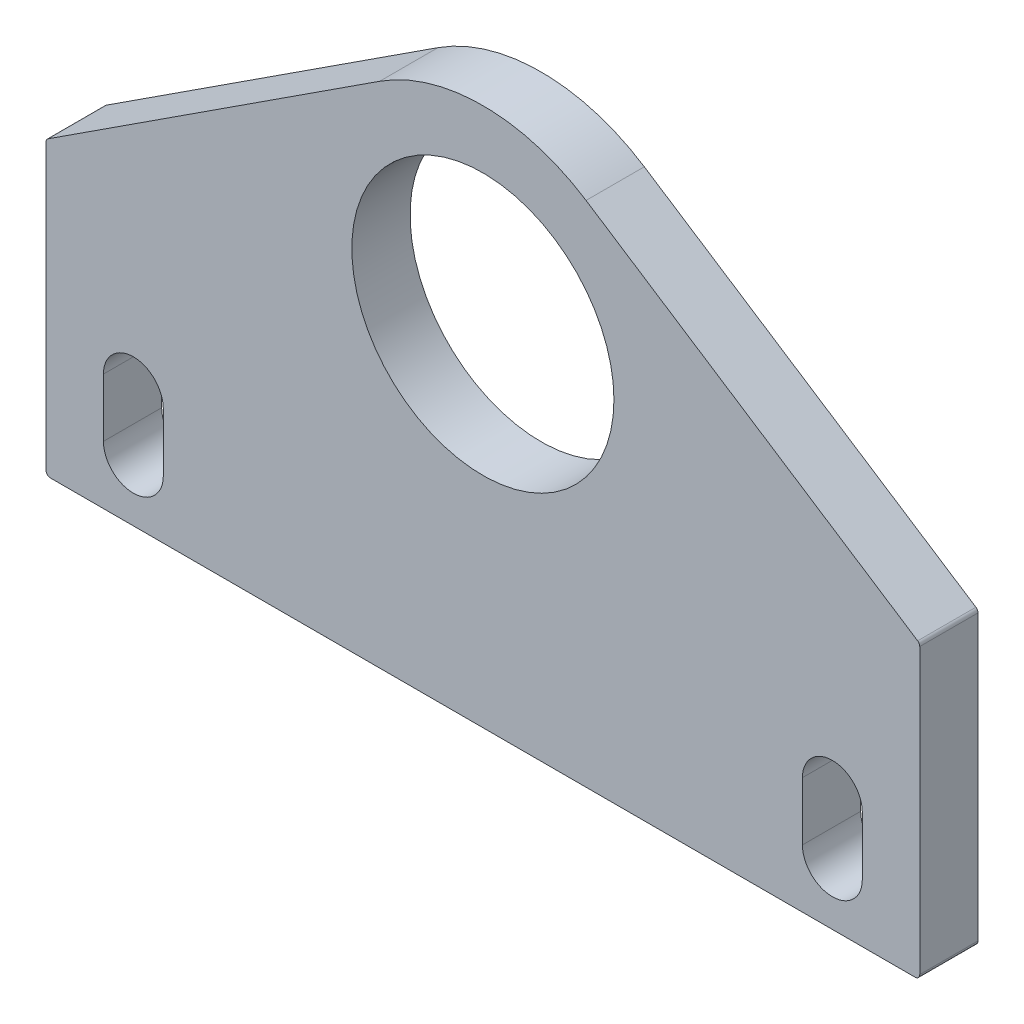
ISO-10303-21;
HEADER;
FILE_DESCRIPTION(('STEP AP214'),'2;1');
FILE_NAME('part.step','',(''),(''),'','','');
FILE_SCHEMA(('AUTOMOTIVE_DESIGN { 1 0 10303 214 1 1 1 1 }'));
ENDSEC;
DATA;
#1=APPLICATION_CONTEXT('core data for automotive mechanical design processes');
#2=APPLICATION_PROTOCOL_DEFINITION('international standard','automotive_design',2000,#1);
#3=PRODUCT_CONTEXT('',#1,'mechanical');
#4=PRODUCT('Part','Part','',(#3));
#5=PRODUCT_RELATED_PRODUCT_CATEGORY('part','',(#4));
#6=PRODUCT_DEFINITION_FORMATION('','',#4);
#7=PRODUCT_DEFINITION_CONTEXT('part definition',#1,'design');
#8=PRODUCT_DEFINITION('design','',#6,#7);
#9=PRODUCT_DEFINITION_SHAPE('','',#8);
#10=(LENGTH_UNIT() NAMED_UNIT(*) SI_UNIT(.MILLI.,.METRE.));
#11=(NAMED_UNIT(*) PLANE_ANGLE_UNIT() SI_UNIT($,.RADIAN.));
#12=(NAMED_UNIT(*) SI_UNIT($,.STERADIAN.) SOLID_ANGLE_UNIT());
#13=UNCERTAINTY_MEASURE_WITH_UNIT(LENGTH_MEASURE(1.E-05),#10,'distance_accuracy_value','');
#14=(GEOMETRIC_REPRESENTATION_CONTEXT(3) GLOBAL_UNCERTAINTY_ASSIGNED_CONTEXT((#13)) GLOBAL_UNIT_ASSIGNED_CONTEXT((#10,
#11,#12)) REPRESENTATION_CONTEXT('',''));
#15=CARTESIAN_POINT('',(0.,0.,0.));
#16=DIRECTION('',(0.,0.,1.));
#17=DIRECTION('',(1.,0.,0.));
#18=AXIS2_PLACEMENT_3D('',#15,#16,#17);
#19=CARTESIAN_POINT('',(0.,0.,6.35));
#20=DIRECTION('',(0.,0.,1.));
#21=DIRECTION('',(1.,0.,0.));
#22=AXIS2_PLACEMENT_3D('',#19,#20,#21);
#23=PLANE('',#22);
#24=DIRECTION('',(0.,-1.,0.));
#25=VECTOR('',#24,1.);
#26=CARTESIAN_POINT('',(-47.625,-6.35,6.35));
#27=LINE('',#26,#25);
#28=CARTESIAN_POINT('',(-47.625,-6.62563490173526,6.35));
#29=VERTEX_POINT('',#28);
#30=CARTESIAN_POINT('',(-47.625,-37.592,6.35));
#31=VERTEX_POINT('',#30);
#32=EDGE_CURVE('E246',#29,#31,#27,.T.);
#33=ORIENTED_EDGE('',*,*,#32,.T.);
#34=CARTESIAN_POINT('',(-47.117,-37.592,6.35));
#35=DIRECTION('',(0.,0.,1.));
#36=DIRECTION('',(1.,0.,0.));
#37=AXIS2_PLACEMENT_3D('',#34,#35,#36);
#38=CIRCLE('',#37,0.508);
#39=CARTESIAN_POINT('',(-47.117,-38.1,6.35));
#40=VERTEX_POINT('',#39);
#41=EDGE_CURVE('E299',#31,#40,#38,.T.);
#42=ORIENTED_EDGE('',*,*,#41,.T.);
#43=DIRECTION('',(1.,0.,0.));
#44=VECTOR('',#43,1.);
#45=CARTESIAN_POINT('',(-47.625,-38.1,6.35));
#46=LINE('',#45,#44);
#47=CARTESIAN_POINT('',(47.117,-38.1,6.35));
#48=VERTEX_POINT('',#47);
#49=EDGE_CURVE('E249',#40,#48,#46,.T.);
#50=ORIENTED_EDGE('',*,*,#49,.T.);
#51=CARTESIAN_POINT('',(47.117,-37.592,6.35));
#52=DIRECTION('',(0.,0.,1.));
#53=DIRECTION('',(1.,0.,0.));
#54=AXIS2_PLACEMENT_3D('',#51,#52,#53);
#55=CIRCLE('',#54,0.508);
#56=CARTESIAN_POINT('',(47.625,-37.592,6.35));
#57=VERTEX_POINT('',#56);
#58=EDGE_CURVE('E295',#48,#57,#55,.T.);
#59=ORIENTED_EDGE('',*,*,#58,.T.);
#60=DIRECTION('',(0.,1.,0.));
#61=VECTOR('',#60,1.);
#62=CARTESIAN_POINT('',(47.625,-38.1,6.35));
#63=LINE('',#62,#61);
#64=CARTESIAN_POINT('',(47.625,-6.62563490173525,6.35));
#65=VERTEX_POINT('',#64);
#66=EDGE_CURVE('E252',#57,#65,#63,.T.);
#67=ORIENTED_EDGE('',*,*,#66,.T.);
#68=CARTESIAN_POINT('',(47.117,-6.62563490173526,6.35));
#69=DIRECTION('',(0.,0.,1.));
#70=DIRECTION('',(1.,0.,0.));
#71=AXIS2_PLACEMENT_3D('',#68,#69,#70);
#72=CIRCLE('',#71,0.508);
#73=CARTESIAN_POINT('',(47.393918343994,-6.19974732178059,6.35));
#74=VERTEX_POINT('',#73);
#75=EDGE_CURVE('E48',#65,#74,#72,.T.);
#76=ORIENTED_EDGE('',*,*,#75,.T.);
#77=DIRECTION('',(-0.838361377863523,0.545114850381803,0.));
#78=VECTOR('',#77,1.);
#79=CARTESIAN_POINT('',(47.625,-6.35,6.35));
#80=LINE('',#79,#78);
#81=CARTESIAN_POINT('',(11.2498077247545,17.3016829356585,6.35));
#82=VERTEX_POINT('',#81);
#83=EDGE_CURVE('E254',#74,#82,#80,.T.);
#84=ORIENTED_EDGE('',*,*,#83,.T.);
#85=CARTESIAN_POINT('',(0.,0.,6.35));
#86=DIRECTION('',(0.,0.,1.));
#87=DIRECTION('',(1.,0.,0.));
#88=AXIS2_PLACEMENT_3D('',#85,#86,#87);
#89=CIRCLE('',#88,20.6375);
#90=CARTESIAN_POINT('',(-11.2498077247545,17.3016829356585,6.35));
#91=VERTEX_POINT('',#90);
#92=EDGE_CURVE('E239',#82,#91,#89,.T.);
#93=ORIENTED_EDGE('',*,*,#92,.T.);
#94=DIRECTION('',(-0.838361377863523,-0.545114850381803,0.));
#95=VECTOR('',#94,1.);
#96=CARTESIAN_POINT('',(-11.2498077247545,17.3016829356585,6.35));
#97=LINE('',#96,#95);
#98=CARTESIAN_POINT('',(-47.393918343994,-6.19974732178058,6.35));
#99=VERTEX_POINT('',#98);
#100=EDGE_CURVE('E242',#91,#99,#97,.T.);
#101=ORIENTED_EDGE('',*,*,#100,.T.);
#102=CARTESIAN_POINT('',(-47.117,-6.62563490173526,6.35));
#103=DIRECTION('',(0.,0.,1.));
#104=DIRECTION('',(1.,0.,0.));
#105=AXIS2_PLACEMENT_3D('',#102,#103,#104);
#106=CIRCLE('',#105,0.508);
#107=EDGE_CURVE('E297',#99,#29,#106,.T.);
#108=ORIENTED_EDGE('',*,*,#107,.T.);
#109=EDGE_LOOP('',(#33,#42,#50,#59,#67,#76,#84,#93,#101,#108));
#110=FACE_BOUND('',#109,.T.);
#111=CARTESIAN_POINT('',(0.,0.,6.35));
#112=DIRECTION('',(0.,0.,1.));
#113=DIRECTION('',(1.,0.,0.));
#114=AXIS2_PLACEMENT_3D('',#111,#112,#113);
#115=CIRCLE('',#114,14.2875);
#116=CARTESIAN_POINT('',(14.2875,0.,6.35));
#117=VERTEX_POINT('',#116);
#118=EDGE_CURVE('E233',#117,#117,#115,.T.);
#119=ORIENTED_EDGE('',*,*,#118,.F.);
#120=EDGE_LOOP('',(#119));
#121=FACE_BOUND('',#120,.T.);
#122=DIRECTION('',(0.,-1.,0.));
#123=VECTOR('',#122,1.);
#124=CARTESIAN_POINT('',(-41.3639,-25.4,6.35));
#125=LINE('',#124,#123);
#126=CARTESIAN_POINT('',(-41.3639,-25.4,6.35));
#127=VERTEX_POINT('',#126);
#128=CARTESIAN_POINT('',(-41.3639,-31.75,6.35));
#129=VERTEX_POINT('',#128);
#130=EDGE_CURVE('E204',#127,#129,#125,.T.);
#131=ORIENTED_EDGE('',*,*,#130,.F.);
#132=CARTESIAN_POINT('',(-38.1,-25.4,6.35));
#133=DIRECTION('',(0.,0.,1.));
#134=DIRECTION('',(1.,0.,0.));
#135=AXIS2_PLACEMENT_3D('',#132,#133,#134);
#136=CIRCLE('',#135,3.26389999999999);
#137=CARTESIAN_POINT('',(-34.8361,-25.4,6.35));
#138=VERTEX_POINT('',#137);
#139=EDGE_CURVE('E202',#138,#127,#136,.T.);
#140=ORIENTED_EDGE('',*,*,#139,.F.);
#141=DIRECTION('',(0.,1.,0.));
#142=VECTOR('',#141,1.);
#143=CARTESIAN_POINT('',(-34.8361,-25.4,6.35));
#144=LINE('',#143,#142);
#145=CARTESIAN_POINT('',(-34.8361,-31.75,6.35));
#146=VERTEX_POINT('',#145);
#147=EDGE_CURVE('E210',#146,#138,#144,.T.);
#148=ORIENTED_EDGE('',*,*,#147,.F.);
#149=CARTESIAN_POINT('',(-38.1,-31.75,6.35));
#150=DIRECTION('',(0.,0.,1.));
#151=DIRECTION('',(1.,0.,0.));
#152=AXIS2_PLACEMENT_3D('',#149,#150,#151);
#153=CIRCLE('',#152,3.26389999999999);
#154=EDGE_CURVE('E207',#129,#146,#153,.T.);
#155=ORIENTED_EDGE('',*,*,#154,.F.);
#156=EDGE_LOOP('',(#131,#140,#148,#155));
#157=FACE_BOUND('',#156,.T.);
#158=DIRECTION('',(0.,-1.,0.));
#159=VECTOR('',#158,1.);
#160=CARTESIAN_POINT('',(34.8361,-25.4,6.35));
#161=LINE('',#160,#159);
#162=CARTESIAN_POINT('',(34.8361,-25.4,6.35));
#163=VERTEX_POINT('',#162);
#164=CARTESIAN_POINT('',(34.8361,-31.75,6.35));
#165=VERTEX_POINT('',#164);
#166=EDGE_CURVE('E171',#163,#165,#161,.T.);
#167=ORIENTED_EDGE('',*,*,#166,.F.);
#168=CARTESIAN_POINT('',(38.1,-25.4,6.35));
#169=DIRECTION('',(0.,0.,1.));
#170=DIRECTION('',(1.,0.,0.));
#171=AXIS2_PLACEMENT_3D('',#168,#169,#170);
#172=CIRCLE('',#171,3.2639);
#173=CARTESIAN_POINT('',(41.3639,-25.4,6.35));
#174=VERTEX_POINT('',#173);
#175=EDGE_CURVE('E161',#174,#163,#172,.T.);
#176=ORIENTED_EDGE('',*,*,#175,.F.);
#177=DIRECTION('',(0.,1.,0.));
#178=VECTOR('',#177,1.);
#179=CARTESIAN_POINT('',(41.3639,-25.4,6.35));
#180=LINE('',#179,#178);
#181=CARTESIAN_POINT('',(41.3639,-31.75,6.35));
#182=VERTEX_POINT('',#181);
#183=EDGE_CURVE('E186',#182,#174,#180,.T.);
#184=ORIENTED_EDGE('',*,*,#183,.F.);
#185=CARTESIAN_POINT('',(38.1,-31.75,6.35));
#186=DIRECTION('',(0.,0.,1.));
#187=DIRECTION('',(1.,0.,0.));
#188=AXIS2_PLACEMENT_3D('',#185,#186,#187);
#189=CIRCLE('',#188,3.2639);
#190=EDGE_CURVE('E184',#165,#182,#189,.T.);
#191=ORIENTED_EDGE('',*,*,#190,.F.);
#192=EDGE_LOOP('',(#167,#176,#184,#191));
#193=FACE_BOUND('',#192,.T.);
#194=ADVANCED_FACE('F33',(#110,#121,#157,#193),#23,.T.);
#195=CARTESIAN_POINT('',(0.,0.,0.));
#196=DIRECTION('',(0.,0.,1.));
#197=DIRECTION('',(1.,0.,0.));
#198=AXIS2_PLACEMENT_3D('',#195,#196,#197);
#199=PLANE('',#198);
#200=CARTESIAN_POINT('',(-38.1,-25.4,0.));
#201=DIRECTION('',(0.,0.,1.));
#202=DIRECTION('',(1.,0.,0.));
#203=AXIS2_PLACEMENT_3D('',#200,#201,#202);
#204=CIRCLE('',#203,3.26389999999999);
#205=CARTESIAN_POINT('',(-34.8361,-25.4,0.));
#206=VERTEX_POINT('',#205);
#207=CARTESIAN_POINT('',(-41.3639,-25.4,0.));
#208=VERTEX_POINT('',#207);
#209=EDGE_CURVE('E179',#206,#208,#204,.T.);
#210=ORIENTED_EDGE('',*,*,#209,.T.);
#211=DIRECTION('',(0.,-1.,0.));
#212=VECTOR('',#211,1.);
#213=CARTESIAN_POINT('',(-41.3639,-25.4,0.));
#214=LINE('',#213,#212);
#215=CARTESIAN_POINT('',(-41.3639,-31.75,0.));
#216=VERTEX_POINT('',#215);
#217=EDGE_CURVE('E215',#208,#216,#214,.T.);
#218=ORIENTED_EDGE('',*,*,#217,.T.);
#219=CARTESIAN_POINT('',(-38.1,-31.75,0.));
#220=DIRECTION('',(0.,0.,1.));
#221=DIRECTION('',(1.,0.,0.));
#222=AXIS2_PLACEMENT_3D('',#219,#220,#221);
#223=CIRCLE('',#222,3.26389999999999);
#224=CARTESIAN_POINT('',(-34.8361,-31.75,0.));
#225=VERTEX_POINT('',#224);
#226=EDGE_CURVE('E218',#216,#225,#223,.T.);
#227=ORIENTED_EDGE('',*,*,#226,.T.);
#228=DIRECTION('',(0.,1.,0.));
#229=VECTOR('',#228,1.);
#230=CARTESIAN_POINT('',(-34.8361,-25.4,0.));
#231=LINE('',#230,#229);
#232=EDGE_CURVE('E205',#225,#206,#231,.T.);
#233=ORIENTED_EDGE('',*,*,#232,.T.);
#234=EDGE_LOOP('',(#210,#218,#227,#233));
#235=FACE_BOUND('',#234,.T.);
#236=DIRECTION('',(1.,0.,0.));
#237=VECTOR('',#236,1.);
#238=CARTESIAN_POINT('',(-47.625,-38.1,0.));
#239=LINE('',#238,#237);
#240=CARTESIAN_POINT('',(-47.117,-38.1,0.));
#241=VERTEX_POINT('',#240);
#242=CARTESIAN_POINT('',(47.117,-38.1,0.));
#243=VERTEX_POINT('',#242);
#244=EDGE_CURVE('E265',#241,#243,#239,.T.);
#245=ORIENTED_EDGE('',*,*,#244,.F.);
#246=CARTESIAN_POINT('',(-47.117,-37.592,0.));
#247=DIRECTION('',(0.,0.,1.));
#248=DIRECTION('',(1.,0.,0.));
#249=AXIS2_PLACEMENT_3D('',#246,#247,#248);
#250=CIRCLE('',#249,0.508);
#251=CARTESIAN_POINT('',(-47.625,-37.592,0.));
#252=VERTEX_POINT('',#251);
#253=EDGE_CURVE('E287',#241,#252,#250,.F.);
#254=ORIENTED_EDGE('',*,*,#253,.T.);
#255=DIRECTION('',(0.,-1.,0.));
#256=VECTOR('',#255,1.);
#257=CARTESIAN_POINT('',(-47.625,-6.35,0.));
#258=LINE('',#257,#256);
#259=CARTESIAN_POINT('',(-47.625,-6.62563490173526,0.));
#260=VERTEX_POINT('',#259);
#261=EDGE_CURVE('E262',#260,#252,#258,.T.);
#262=ORIENTED_EDGE('',*,*,#261,.F.);
#263=CARTESIAN_POINT('',(-47.117,-6.62563490173526,0.));
#264=DIRECTION('',(0.,0.,1.));
#265=DIRECTION('',(1.,0.,0.));
#266=AXIS2_PLACEMENT_3D('',#263,#264,#265);
#267=CIRCLE('',#266,0.508);
#268=CARTESIAN_POINT('',(-47.393918343994,-6.19974732178058,0.));
#269=VERTEX_POINT('',#268);
#270=EDGE_CURVE('E285',#260,#269,#267,.F.);
#271=ORIENTED_EDGE('',*,*,#270,.T.);
#272=DIRECTION('',(-0.838361377863523,-0.545114850381803,0.));
#273=VECTOR('',#272,1.);
#274=CARTESIAN_POINT('',(-11.2498077247545,17.3016829356585,0.));
#275=LINE('',#274,#273);
#276=CARTESIAN_POINT('',(-11.2498077247545,17.3016829356585,0.));
#277=VERTEX_POINT('',#276);
#278=EDGE_CURVE('E259',#277,#269,#275,.T.);
#279=ORIENTED_EDGE('',*,*,#278,.F.);
#280=CARTESIAN_POINT('',(0.,0.,0.));
#281=DIRECTION('',(0.,0.,1.));
#282=DIRECTION('',(1.,0.,0.));
#283=AXIS2_PLACEMENT_3D('',#280,#281,#282);
#284=CIRCLE('',#283,20.6375);
#285=CARTESIAN_POINT('',(11.2498077247545,17.3016829356585,0.));
#286=VERTEX_POINT('',#285);
#287=EDGE_CURVE('E236',#286,#277,#284,.T.);
#288=ORIENTED_EDGE('',*,*,#287,.F.);
#289=DIRECTION('',(-0.838361377863523,0.545114850381803,0.));
#290=VECTOR('',#289,1.);
#291=CARTESIAN_POINT('',(47.625,-6.35,0.));
#292=LINE('',#291,#290);
#293=CARTESIAN_POINT('',(47.393918343994,-6.19974732178059,0.));
#294=VERTEX_POINT('',#293);
#295=EDGE_CURVE('E243',#294,#286,#292,.T.);
#296=ORIENTED_EDGE('',*,*,#295,.F.);
#297=CARTESIAN_POINT('',(47.117,-6.62563490173526,0.));
#298=DIRECTION('',(0.,0.,1.));
#299=DIRECTION('',(1.,0.,0.));
#300=AXIS2_PLACEMENT_3D('',#297,#298,#299);
#301=CIRCLE('',#300,0.508);
#302=CARTESIAN_POINT('',(47.625,-6.62563490173525,0.));
#303=VERTEX_POINT('',#302);
#304=EDGE_CURVE('E281',#294,#303,#301,.F.);
#305=ORIENTED_EDGE('',*,*,#304,.T.);
#306=DIRECTION('',(0.,1.,0.));
#307=VECTOR('',#306,1.);
#308=CARTESIAN_POINT('',(47.625,-38.1,0.));
#309=LINE('',#308,#307);
#310=CARTESIAN_POINT('',(47.625,-37.592,0.));
#311=VERTEX_POINT('',#310);
#312=EDGE_CURVE('E268',#311,#303,#309,.T.);
#313=ORIENTED_EDGE('',*,*,#312,.F.);
#314=CARTESIAN_POINT('',(47.117,-37.592,0.));
#315=DIRECTION('',(0.,0.,1.));
#316=DIRECTION('',(1.,0.,0.));
#317=AXIS2_PLACEMENT_3D('',#314,#315,#316);
#318=CIRCLE('',#317,0.508);
#319=EDGE_CURVE('E283',#311,#243,#318,.F.);
#320=ORIENTED_EDGE('',*,*,#319,.T.);
#321=EDGE_LOOP('',(#245,#254,#262,#271,#279,#288,#296,#305,#313,#320));
#322=FACE_BOUND('',#321,.T.);
#323=CARTESIAN_POINT('',(0.,0.,0.));
#324=DIRECTION('',(0.,0.,1.));
#325=DIRECTION('',(1.,0.,0.));
#326=AXIS2_PLACEMENT_3D('',#323,#324,#325);
#327=CIRCLE('',#326,14.2875);
#328=CARTESIAN_POINT('',(14.2875,0.,0.));
#329=VERTEX_POINT('',#328);
#330=EDGE_CURVE('E232',#329,#329,#327,.T.);
#331=ORIENTED_EDGE('',*,*,#330,.T.);
#332=EDGE_LOOP('',(#331));
#333=FACE_BOUND('',#332,.T.);
#334=CARTESIAN_POINT('',(38.1,-25.4,0.));
#335=DIRECTION('',(0.,0.,1.));
#336=DIRECTION('',(1.,0.,0.));
#337=AXIS2_PLACEMENT_3D('',#334,#335,#336);
#338=CIRCLE('',#337,3.2639);
#339=CARTESIAN_POINT('',(41.3639,-25.4,0.));
#340=VERTEX_POINT('',#339);
#341=CARTESIAN_POINT('',(34.8361,-25.4,0.));
#342=VERTEX_POINT('',#341);
#343=EDGE_CURVE('E190',#340,#342,#338,.T.);
#344=ORIENTED_EDGE('',*,*,#343,.T.);
#345=DIRECTION('',(0.,-1.,0.));
#346=VECTOR('',#345,1.);
#347=CARTESIAN_POINT('',(34.8361,-25.4,0.));
#348=LINE('',#347,#346);
#349=CARTESIAN_POINT('',(34.8361,-31.75,0.));
#350=VERTEX_POINT('',#349);
#351=EDGE_CURVE('E178',#342,#350,#348,.T.);
#352=ORIENTED_EDGE('',*,*,#351,.T.);
#353=CARTESIAN_POINT('',(38.1,-31.75,0.));
#354=DIRECTION('',(0.,0.,1.));
#355=DIRECTION('',(1.,0.,0.));
#356=AXIS2_PLACEMENT_3D('',#353,#354,#355);
#357=CIRCLE('',#356,3.2639);
#358=CARTESIAN_POINT('',(41.3639,-31.75,0.));
#359=VERTEX_POINT('',#358);
#360=EDGE_CURVE('E193',#350,#359,#357,.T.);
#361=ORIENTED_EDGE('',*,*,#360,.T.);
#362=DIRECTION('',(0.,1.,0.));
#363=VECTOR('',#362,1.);
#364=CARTESIAN_POINT('',(41.3639,-25.4,0.));
#365=LINE('',#364,#363);
#366=EDGE_CURVE('E172',#359,#340,#365,.T.);
#367=ORIENTED_EDGE('',*,*,#366,.T.);
#368=EDGE_LOOP('',(#344,#352,#361,#367));
#369=FACE_BOUND('',#368,.T.);
#370=ADVANCED_FACE('F311',(#235,#322,#333,#369),#199,.F.);
#371=CARTESIAN_POINT('',(0.,0.,6.35));
#372=DIRECTION('',(0.,0.,-1.));
#373=DIRECTION('',(-1.,0.,0.));
#374=AXIS2_PLACEMENT_3D('',#371,#372,#373);
#375=CYLINDRICAL_SURFACE('',#374,20.6375);
#376=ORIENTED_EDGE('',*,*,#287,.T.);
#377=DIRECTION('',(0.,0.,-1.));
#378=VECTOR('',#377,1.);
#379=CARTESIAN_POINT('',(-11.2498077247545,17.3016829356585,6.35));
#380=LINE('',#379,#378);
#381=EDGE_CURVE('E273',#91,#277,#380,.T.);
#382=ORIENTED_EDGE('',*,*,#381,.F.);
#383=ORIENTED_EDGE('',*,*,#92,.F.);
#384=DIRECTION('',(0.,0.,-1.));
#385=VECTOR('',#384,1.);
#386=CARTESIAN_POINT('',(11.2498077247545,17.3016829356585,6.35));
#387=LINE('',#386,#385);
#388=EDGE_CURVE('E256',#82,#286,#387,.T.);
#389=ORIENTED_EDGE('',*,*,#388,.T.);
#390=EDGE_LOOP('',(#376,#382,#383,#389));
#391=FACE_BOUND('',#390,.T.);
#392=ADVANCED_FACE('F325',(#391),#375,.T.);
#393=CARTESIAN_POINT('',(-11.2498077247545,17.3016829356585,6.35));
#394=DIRECTION('',(0.545114850381803,-0.838361377863523,0.));
#395=DIRECTION('',(0.838361377863523,0.545114850381803,0.));
#396=AXIS2_PLACEMENT_3D('',#393,#394,#395);
#397=PLANE('',#396);
#398=ORIENTED_EDGE('',*,*,#278,.T.);
#399=DIRECTION('',(0.,0.,-1.));
#400=VECTOR('',#399,1.);
#401=CARTESIAN_POINT('',(-47.393918343994,-6.19974732178059,6.35));
#402=LINE('',#401,#400);
#403=EDGE_CURVE('E301',#269,#99,#402,.F.);
#404=ORIENTED_EDGE('',*,*,#403,.T.);
#405=ORIENTED_EDGE('',*,*,#100,.F.);
#406=ORIENTED_EDGE('',*,*,#381,.T.);
#407=EDGE_LOOP('',(#398,#404,#405,#406));
#408=FACE_BOUND('',#407,.T.);
#409=ADVANCED_FACE('F327',(#408),#397,.F.);
#410=CARTESIAN_POINT('',(-47.625,-6.35,6.35));
#411=DIRECTION('',(1.,0.,0.));
#412=DIRECTION('',(0.,0.,-1.));
#413=AXIS2_PLACEMENT_3D('',#410,#411,#412);
#414=PLANE('',#413);
#415=ORIENTED_EDGE('',*,*,#261,.T.);
#416=DIRECTION('',(0.,0.,-1.));
#417=VECTOR('',#416,1.);
#418=CARTESIAN_POINT('',(-47.625,-37.592,6.35));
#419=LINE('',#418,#417);
#420=EDGE_CURVE('E292',#252,#31,#419,.F.);
#421=ORIENTED_EDGE('',*,*,#420,.T.);
#422=ORIENTED_EDGE('',*,*,#32,.F.);
#423=DIRECTION('',(0.,0.,-1.));
#424=VECTOR('',#423,1.);
#425=CARTESIAN_POINT('',(-47.625,-6.62563490173526,6.35));
#426=LINE('',#425,#424);
#427=EDGE_CURVE('E289',#29,#260,#426,.T.);
#428=ORIENTED_EDGE('',*,*,#427,.T.);
#429=EDGE_LOOP('',(#415,#421,#422,#428));
#430=FACE_BOUND('',#429,.T.);
#431=ADVANCED_FACE('F335',(#430),#414,.F.);
#432=CARTESIAN_POINT('',(-47.625,-38.1,6.35));
#433=DIRECTION('',(0.,1.,0.));
#434=DIRECTION('',(0.,0.,1.));
#435=AXIS2_PLACEMENT_3D('',#432,#433,#434);
#436=PLANE('',#435);
#437=ORIENTED_EDGE('',*,*,#49,.F.);
#438=DIRECTION('',(0.,0.,-1.));
#439=VECTOR('',#438,1.);
#440=CARTESIAN_POINT('',(-47.117,-38.1,6.35));
#441=LINE('',#440,#439);
#442=EDGE_CURVE('E278',#40,#241,#441,.T.);
#443=ORIENTED_EDGE('',*,*,#442,.T.);
#444=ORIENTED_EDGE('',*,*,#244,.T.);
#445=DIRECTION('',(0.,0.,-1.));
#446=VECTOR('',#445,1.);
#447=CARTESIAN_POINT('',(47.117,-38.1,6.35));
#448=LINE('',#447,#446);
#449=EDGE_CURVE('E276',#243,#48,#448,.F.);
#450=ORIENTED_EDGE('',*,*,#449,.T.);
#451=EDGE_LOOP('',(#437,#443,#444,#450));
#452=FACE_BOUND('',#451,.T.);
#453=ADVANCED_FACE('F343',(#452),#436,.F.);
#454=CARTESIAN_POINT('',(47.625,-38.1,6.35));
#455=DIRECTION('',(-1.,0.,0.));
#456=DIRECTION('',(0.,0.,1.));
#457=AXIS2_PLACEMENT_3D('',#454,#455,#456);
#458=PLANE('',#457);
#459=ORIENTED_EDGE('',*,*,#66,.F.);
#460=DIRECTION('',(0.,0.,-1.));
#461=VECTOR('',#460,1.);
#462=CARTESIAN_POINT('',(47.625,-37.592,6.35));
#463=LINE('',#462,#461);
#464=EDGE_CURVE('E41',#57,#311,#463,.T.);
#465=ORIENTED_EDGE('',*,*,#464,.T.);
#466=ORIENTED_EDGE('',*,*,#312,.T.);
#467=DIRECTION('',(0.,0.,-1.));
#468=VECTOR('',#467,1.);
#469=CARTESIAN_POINT('',(47.625,-6.62563490173525,6.35));
#470=LINE('',#469,#468);
#471=EDGE_CURVE('E56',#303,#65,#470,.F.);
#472=ORIENTED_EDGE('',*,*,#471,.T.);
#473=EDGE_LOOP('',(#459,#465,#466,#472));
#474=FACE_BOUND('',#473,.T.);
#475=ADVANCED_FACE('F306',(#474),#458,.F.);
#476=CARTESIAN_POINT('',(47.625,-6.35,6.35));
#477=DIRECTION('',(-0.545114850381803,-0.838361377863523,0.));
#478=DIRECTION('',(0.838361377863523,-0.545114850381803,0.));
#479=AXIS2_PLACEMENT_3D('',#476,#477,#478);
#480=PLANE('',#479);
#481=ORIENTED_EDGE('',*,*,#83,.F.);
#482=DIRECTION('',(0.,0.,-1.));
#483=VECTOR('',#482,1.);
#484=CARTESIAN_POINT('',(47.393918343994,-6.19974732178059,6.35));
#485=LINE('',#484,#483);
#486=EDGE_CURVE('E11',#74,#294,#485,.T.);
#487=ORIENTED_EDGE('',*,*,#486,.T.);
#488=ORIENTED_EDGE('',*,*,#295,.T.);
#489=ORIENTED_EDGE('',*,*,#388,.F.);
#490=EDGE_LOOP('',(#481,#487,#488,#489));
#491=FACE_BOUND('',#490,.T.);
#492=ADVANCED_FACE('F318',(#491),#480,.F.);
#493=CARTESIAN_POINT('',(0.,0.,6.35));
#494=DIRECTION('',(0.,0.,-1.));
#495=DIRECTION('',(-1.,0.,0.));
#496=AXIS2_PLACEMENT_3D('',#493,#494,#495);
#497=CYLINDRICAL_SURFACE('',#496,14.2875);
#498=ORIENTED_EDGE('',*,*,#118,.T.);
#499=EDGE_LOOP('',(#498));
#500=FACE_BOUND('',#499,.T.);
#501=ORIENTED_EDGE('',*,*,#330,.F.);
#502=EDGE_LOOP('',(#501));
#503=FACE_BOUND('',#502,.T.);
#504=ADVANCED_FACE('F361',(#500,#503),#497,.F.);
#505=CARTESIAN_POINT('',(-38.1,-25.4,6.35));
#506=DIRECTION('',(0.,0.,-1.));
#507=DIRECTION('',(-1.,0.,0.));
#508=AXIS2_PLACEMENT_3D('',#505,#506,#507);
#509=CYLINDRICAL_SURFACE('',#508,3.26389999999999);
#510=ORIENTED_EDGE('',*,*,#209,.F.);
#511=DIRECTION('',(0.,0.,-1.));
#512=VECTOR('',#511,1.);
#513=CARTESIAN_POINT('',(-34.8361,-25.4,6.35));
#514=LINE('',#513,#512);
#515=EDGE_CURVE('E212',#138,#206,#514,.T.);
#516=ORIENTED_EDGE('',*,*,#515,.F.);
#517=ORIENTED_EDGE('',*,*,#139,.T.);
#518=DIRECTION('',(0.,0.,-1.));
#519=VECTOR('',#518,1.);
#520=CARTESIAN_POINT('',(-41.3639,-25.4,6.35));
#521=LINE('',#520,#519);
#522=EDGE_CURVE('E229',#127,#208,#521,.T.);
#523=ORIENTED_EDGE('',*,*,#522,.T.);
#524=EDGE_LOOP('',(#510,#516,#517,#523));
#525=FACE_BOUND('',#524,.T.);
#526=ADVANCED_FACE('F404',(#525),#509,.F.);
#527=CARTESIAN_POINT('',(-41.3639,-25.4,6.35));
#528=DIRECTION('',(1.,0.,0.));
#529=DIRECTION('',(0.,0.,-1.));
#530=AXIS2_PLACEMENT_3D('',#527,#528,#529);
#531=PLANE('',#530);
#532=ORIENTED_EDGE('',*,*,#217,.F.);
#533=ORIENTED_EDGE('',*,*,#522,.F.);
#534=ORIENTED_EDGE('',*,*,#130,.T.);
#535=DIRECTION('',(0.,0.,-1.));
#536=VECTOR('',#535,1.);
#537=CARTESIAN_POINT('',(-41.3639,-31.75,6.35));
#538=LINE('',#537,#536);
#539=EDGE_CURVE('E227',#129,#216,#538,.T.);
#540=ORIENTED_EDGE('',*,*,#539,.T.);
#541=EDGE_LOOP('',(#532,#533,#534,#540));
#542=FACE_BOUND('',#541,.T.);
#543=ADVANCED_FACE('F401',(#542),#531,.T.);
#544=CARTESIAN_POINT('',(-38.1,-31.75,6.35));
#545=DIRECTION('',(0.,0.,-1.));
#546=DIRECTION('',(-1.,0.,0.));
#547=AXIS2_PLACEMENT_3D('',#544,#545,#546);
#548=CYLINDRICAL_SURFACE('',#547,3.26389999999999);
#549=ORIENTED_EDGE('',*,*,#226,.F.);
#550=ORIENTED_EDGE('',*,*,#539,.F.);
#551=ORIENTED_EDGE('',*,*,#154,.T.);
#552=DIRECTION('',(0.,0.,-1.));
#553=VECTOR('',#552,1.);
#554=CARTESIAN_POINT('',(-34.8361,-31.75,6.35));
#555=LINE('',#554,#553);
#556=EDGE_CURVE('E225',#146,#225,#555,.T.);
#557=ORIENTED_EDGE('',*,*,#556,.T.);
#558=EDGE_LOOP('',(#549,#550,#551,#557));
#559=FACE_BOUND('',#558,.T.);
#560=ADVANCED_FACE('F397',(#559),#548,.F.);
#561=CARTESIAN_POINT('',(-34.8361,-25.4,6.35));
#562=DIRECTION('',(-1.,0.,0.));
#563=DIRECTION('',(0.,0.,1.));
#564=AXIS2_PLACEMENT_3D('',#561,#562,#563);
#565=PLANE('',#564);
#566=ORIENTED_EDGE('',*,*,#232,.F.);
#567=ORIENTED_EDGE('',*,*,#556,.F.);
#568=ORIENTED_EDGE('',*,*,#147,.T.);
#569=ORIENTED_EDGE('',*,*,#515,.T.);
#570=EDGE_LOOP('',(#566,#567,#568,#569));
#571=FACE_BOUND('',#570,.T.);
#572=ADVANCED_FACE('F394',(#571),#565,.T.);
#573=CARTESIAN_POINT('',(38.1,-25.4,6.35));
#574=DIRECTION('',(0.,0.,-1.));
#575=DIRECTION('',(-1.,0.,0.));
#576=AXIS2_PLACEMENT_3D('',#573,#574,#575);
#577=CYLINDRICAL_SURFACE('',#576,3.2639);
#578=ORIENTED_EDGE('',*,*,#343,.F.);
#579=DIRECTION('',(0.,0.,-1.));
#580=VECTOR('',#579,1.);
#581=CARTESIAN_POINT('',(41.3639,-25.4,6.35));
#582=LINE('',#581,#580);
#583=EDGE_CURVE('E167',#174,#340,#582,.T.);
#584=ORIENTED_EDGE('',*,*,#583,.F.);
#585=ORIENTED_EDGE('',*,*,#175,.T.);
#586=DIRECTION('',(0.,0.,-1.));
#587=VECTOR('',#586,1.);
#588=CARTESIAN_POINT('',(34.8361,-25.4,6.35));
#589=LINE('',#588,#587);
#590=EDGE_CURVE('E164',#163,#342,#589,.T.);
#591=ORIENTED_EDGE('',*,*,#590,.T.);
#592=EDGE_LOOP('',(#578,#584,#585,#591));
#593=FACE_BOUND('',#592,.T.);
#594=ADVANCED_FACE('F163',(#593),#577,.F.);
#595=CARTESIAN_POINT('',(34.8361,-25.4,6.35));
#596=DIRECTION('',(1.,0.,0.));
#597=DIRECTION('',(0.,0.,-1.));
#598=AXIS2_PLACEMENT_3D('',#595,#596,#597);
#599=PLANE('',#598);
#600=ORIENTED_EDGE('',*,*,#351,.F.);
#601=ORIENTED_EDGE('',*,*,#590,.F.);
#602=ORIENTED_EDGE('',*,*,#166,.T.);
#603=DIRECTION('',(0.,0.,-1.));
#604=VECTOR('',#603,1.);
#605=CARTESIAN_POINT('',(34.8361,-31.75,6.35));
#606=LINE('',#605,#604);
#607=EDGE_CURVE('E180',#165,#350,#606,.T.);
#608=ORIENTED_EDGE('',*,*,#607,.T.);
#609=EDGE_LOOP('',(#600,#601,#602,#608));
#610=FACE_BOUND('',#609,.T.);
#611=ADVANCED_FACE('F175',(#610),#599,.T.);
#612=CARTESIAN_POINT('',(38.1,-31.75,6.35));
#613=DIRECTION('',(0.,0.,-1.));
#614=DIRECTION('',(-1.,0.,0.));
#615=AXIS2_PLACEMENT_3D('',#612,#613,#614);
#616=CYLINDRICAL_SURFACE('',#615,3.2639);
#617=ORIENTED_EDGE('',*,*,#360,.F.);
#618=ORIENTED_EDGE('',*,*,#607,.F.);
#619=ORIENTED_EDGE('',*,*,#190,.T.);
#620=DIRECTION('',(0.,0.,-1.));
#621=VECTOR('',#620,1.);
#622=CARTESIAN_POINT('',(41.3639,-31.75,6.35));
#623=LINE('',#622,#621);
#624=EDGE_CURVE('E199',#182,#359,#623,.T.);
#625=ORIENTED_EDGE('',*,*,#624,.T.);
#626=EDGE_LOOP('',(#617,#618,#619,#625));
#627=FACE_BOUND('',#626,.T.);
#628=ADVANCED_FACE('F381',(#627),#616,.F.);
#629=CARTESIAN_POINT('',(41.3639,-25.4,6.35));
#630=DIRECTION('',(-1.,0.,0.));
#631=DIRECTION('',(0.,0.,1.));
#632=AXIS2_PLACEMENT_3D('',#629,#630,#631);
#633=PLANE('',#632);
#634=ORIENTED_EDGE('',*,*,#366,.F.);
#635=ORIENTED_EDGE('',*,*,#624,.F.);
#636=ORIENTED_EDGE('',*,*,#183,.T.);
#637=ORIENTED_EDGE('',*,*,#583,.T.);
#638=EDGE_LOOP('',(#634,#635,#636,#637));
#639=FACE_BOUND('',#638,.T.);
#640=ADVANCED_FACE('F377',(#639),#633,.T.);
#641=CARTESIAN_POINT('',(-47.117,-37.592,6.35));
#642=DIRECTION('',(0.,0.,-1.));
#643=DIRECTION('',(-1.,0.,0.));
#644=AXIS2_PLACEMENT_3D('',#641,#642,#643);
#645=CYLINDRICAL_SURFACE('',#644,0.508);
#646=ORIENTED_EDGE('',*,*,#41,.F.);
#647=ORIENTED_EDGE('',*,*,#420,.F.);
#648=ORIENTED_EDGE('',*,*,#253,.F.);
#649=ORIENTED_EDGE('',*,*,#442,.F.);
#650=EDGE_LOOP('',(#646,#647,#648,#649));
#651=FACE_BOUND('',#650,.T.);
#652=ADVANCED_FACE('F339',(#651),#645,.T.);
#653=CARTESIAN_POINT('',(-47.117,-6.62563490173526,6.35));
#654=DIRECTION('',(0.,0.,-1.));
#655=DIRECTION('',(-1.,0.,0.));
#656=AXIS2_PLACEMENT_3D('',#653,#654,#655);
#657=CYLINDRICAL_SURFACE('',#656,0.508);
#658=ORIENTED_EDGE('',*,*,#107,.F.);
#659=ORIENTED_EDGE('',*,*,#403,.F.);
#660=ORIENTED_EDGE('',*,*,#270,.F.);
#661=ORIENTED_EDGE('',*,*,#427,.F.);
#662=EDGE_LOOP('',(#658,#659,#660,#661));
#663=FACE_BOUND('',#662,.T.);
#664=ADVANCED_FACE('F330',(#663),#657,.T.);
#665=CARTESIAN_POINT('',(47.117,-37.592,6.35));
#666=DIRECTION('',(0.,0.,-1.));
#667=DIRECTION('',(-1.,0.,0.));
#668=AXIS2_PLACEMENT_3D('',#665,#666,#667);
#669=CYLINDRICAL_SURFACE('',#668,0.508);
#670=ORIENTED_EDGE('',*,*,#58,.F.);
#671=ORIENTED_EDGE('',*,*,#449,.F.);
#672=ORIENTED_EDGE('',*,*,#319,.F.);
#673=ORIENTED_EDGE('',*,*,#464,.F.);
#674=EDGE_LOOP('',(#670,#671,#672,#673));
#675=FACE_BOUND('',#674,.T.);
#676=ADVANCED_FACE('F345',(#675),#669,.T.);
#677=CARTESIAN_POINT('',(47.117,-6.62563490173526,6.35));
#678=DIRECTION('',(0.,0.,-1.));
#679=DIRECTION('',(-1.,0.,0.));
#680=AXIS2_PLACEMENT_3D('',#677,#678,#679);
#681=CYLINDRICAL_SURFACE('',#680,0.508);
#682=ORIENTED_EDGE('',*,*,#75,.F.);
#683=ORIENTED_EDGE('',*,*,#471,.F.);
#684=ORIENTED_EDGE('',*,*,#304,.F.);
#685=ORIENTED_EDGE('',*,*,#486,.F.);
#686=EDGE_LOOP('',(#682,#683,#684,#685));
#687=FACE_BOUND('',#686,.T.);
#688=ADVANCED_FACE('F35',(#687),#681,.T.);
#689=CLOSED_SHELL('',(#194,#370,#392,#409,#431,#453,#475,#492,#504,#526,#543,#560,#572,#594,
#611,#628,#640,#652,#664,#676,#688));
#690=MANIFOLD_SOLID_BREP('B2',#689);
#691=ADVANCED_BREP_SHAPE_REPRESENTATION('',(#18,#690),#14);
#692=SHAPE_DEFINITION_REPRESENTATION(#9,#691);
ENDSEC;
END-ISO-10303-21;
